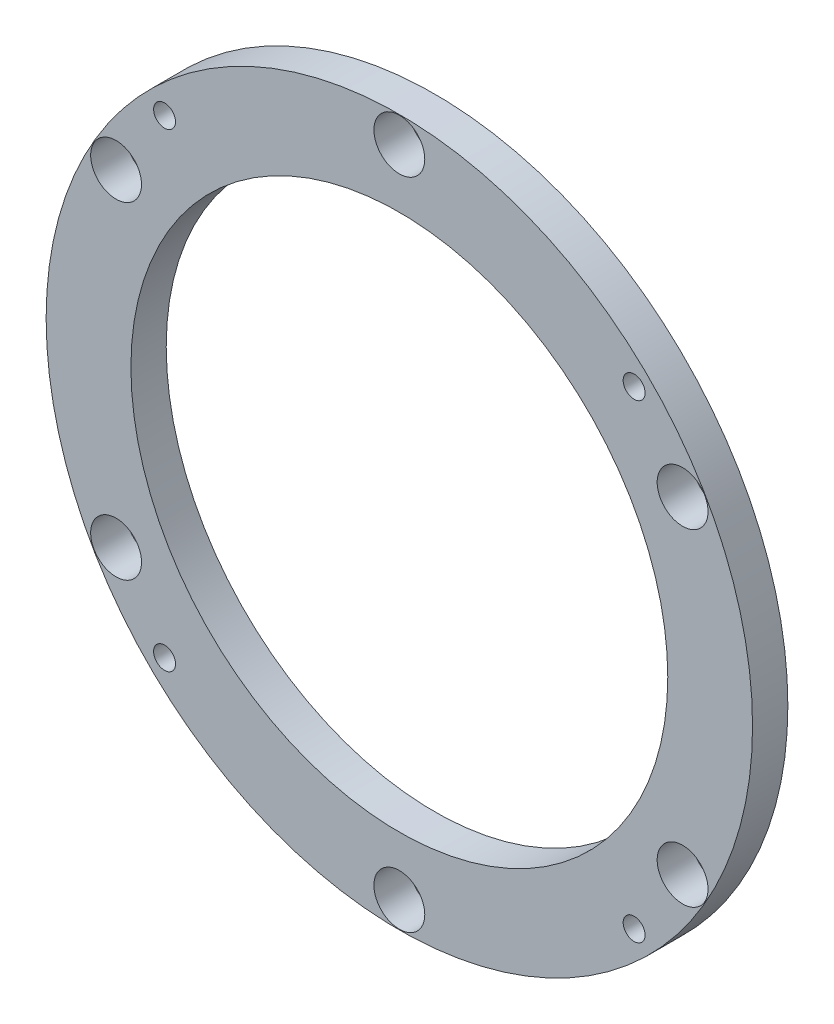
ISO-10303-21;
HEADER;
FILE_DESCRIPTION(('STEP AP214'),'2;1');
FILE_NAME('part.step','',(''),(''),'','','');
FILE_SCHEMA(('AUTOMOTIVE_DESIGN { 1 0 10303 214 1 1 1 1 }'));
ENDSEC;
DATA;
#1=APPLICATION_CONTEXT('core data for automotive mechanical design processes');
#2=APPLICATION_PROTOCOL_DEFINITION('international standard','automotive_design',2000,#1);
#3=PRODUCT_CONTEXT('',#1,'mechanical');
#4=PRODUCT('Part','Part','',(#3));
#5=PRODUCT_RELATED_PRODUCT_CATEGORY('part','',(#4));
#6=PRODUCT_DEFINITION_FORMATION('','',#4);
#7=PRODUCT_DEFINITION_CONTEXT('part definition',#1,'design');
#8=PRODUCT_DEFINITION('design','',#6,#7);
#9=PRODUCT_DEFINITION_SHAPE('','',#8);
#10=(LENGTH_UNIT() NAMED_UNIT(*) SI_UNIT(.MILLI.,.METRE.));
#11=(NAMED_UNIT(*) PLANE_ANGLE_UNIT() SI_UNIT($,.RADIAN.));
#12=(NAMED_UNIT(*) SI_UNIT($,.STERADIAN.) SOLID_ANGLE_UNIT());
#13=UNCERTAINTY_MEASURE_WITH_UNIT(LENGTH_MEASURE(1.E-05),#10,'distance_accuracy_value','');
#14=(GEOMETRIC_REPRESENTATION_CONTEXT(3) GLOBAL_UNCERTAINTY_ASSIGNED_CONTEXT((#13)) GLOBAL_UNIT_ASSIGNED_CONTEXT((#10,
#11,#12)) REPRESENTATION_CONTEXT('',''));
#15=CARTESIAN_POINT('',(0.,0.,0.));
#16=DIRECTION('',(0.,0.,1.));
#17=DIRECTION('',(1.,0.,0.));
#18=AXIS2_PLACEMENT_3D('',#15,#16,#17);
#19=CARTESIAN_POINT('',(0.,0.,5.));
#20=DIRECTION('',(0.,0.,1.));
#21=DIRECTION('',(1.,0.,0.));
#22=AXIS2_PLACEMENT_3D('',#19,#20,#21);
#23=PLANE('',#22);
#24=CARTESIAN_POINT('',(0.,0.,5.));
#25=DIRECTION('',(0.,0.,1.));
#26=DIRECTION('',(1.,0.,0.));
#27=AXIS2_PLACEMENT_3D('',#24,#25,#26);
#28=CIRCLE('',#27,38.);
#29=CARTESIAN_POINT('',(38.,0.,5.));
#30=VERTEX_POINT('',#29);
#31=EDGE_CURVE('E102',#30,#30,#28,.T.);
#32=ORIENTED_EDGE('',*,*,#31,.F.);
#33=EDGE_LOOP('',(#32));
#34=FACE_BOUND('',#33,.T.);
#35=CARTESIAN_POINT('',(33.2340187157698,-33.2340187157657,5.));
#36=DIRECTION('',(0.,0.,1.));
#37=DIRECTION('',(1.,0.,0.));
#38=AXIS2_PLACEMENT_3D('',#35,#36,#37);
#39=CIRCLE('',#38,1.55);
#40=CARTESIAN_POINT('',(34.7840187157698,-33.2340187157657,5.));
#41=VERTEX_POINT('',#40);
#42=EDGE_CURVE('E90',#41,#41,#39,.T.);
#43=ORIENTED_EDGE('',*,*,#42,.F.);
#44=EDGE_LOOP('',(#43));
#45=FACE_BOUND('',#44,.T.);
#46=CARTESIAN_POINT('',(-33.2340187157679,33.2340187157675,5.));
#47=DIRECTION('',(0.,0.,1.));
#48=DIRECTION('',(1.,0.,0.));
#49=AXIS2_PLACEMENT_3D('',#46,#47,#48);
#50=CIRCLE('',#49,1.55);
#51=CARTESIAN_POINT('',(-31.6840187157679,33.2340187157675,5.));
#52=VERTEX_POINT('',#51);
#53=EDGE_CURVE('E78',#52,#52,#50,.T.);
#54=ORIENTED_EDGE('',*,*,#53,.F.);
#55=EDGE_LOOP('',(#54));
#56=FACE_BOUND('',#55,.T.);
#57=CARTESIAN_POINT('',(40.0969761952195,-23.1499999999999,5.));
#58=DIRECTION('',(0.,0.,1.));
#59=DIRECTION('',(1.,0.,0.));
#60=AXIS2_PLACEMENT_3D('',#57,#58,#59);
#61=CIRCLE('',#60,3.6);
#62=CARTESIAN_POINT('',(43.6969761952195,-23.1499999999999,5.));
#63=VERTEX_POINT('',#62);
#64=EDGE_CURVE('E66',#63,#63,#61,.T.);
#65=ORIENTED_EDGE('',*,*,#64,.F.);
#66=EDGE_LOOP('',(#65));
#67=FACE_BOUND('',#66,.T.);
#68=CARTESIAN_POINT('',(-3.05311331771918E-13,46.3,5.));
#69=DIRECTION('',(0.,0.,1.));
#70=DIRECTION('',(1.,0.,0.));
#71=AXIS2_PLACEMENT_3D('',#68,#69,#70);
#72=CIRCLE('',#71,3.6);
#73=CARTESIAN_POINT('',(3.59999999999969,46.3,5.));
#74=VERTEX_POINT('',#73);
#75=EDGE_CURVE('E54',#74,#74,#72,.T.);
#76=ORIENTED_EDGE('',*,*,#75,.F.);
#77=EDGE_LOOP('',(#76));
#78=FACE_BOUND('',#77,.T.);
#79=CARTESIAN_POINT('',(-40.0969761952192,-23.1500000000004,5.));
#80=DIRECTION('',(0.,0.,1.));
#81=DIRECTION('',(1.,0.,0.));
#82=AXIS2_PLACEMENT_3D('',#79,#80,#81);
#83=CIRCLE('',#82,3.6);
#84=CARTESIAN_POINT('',(-36.4969761952192,-23.1500000000004,5.));
#85=VERTEX_POINT('',#84);
#86=EDGE_CURVE('E43',#85,#85,#83,.T.);
#87=ORIENTED_EDGE('',*,*,#86,.F.);
#88=EDGE_LOOP('',(#87));
#89=FACE_BOUND('',#88,.T.);
#90=CARTESIAN_POINT('',(0.,0.,5.));
#91=DIRECTION('',(0.,0.,1.));
#92=DIRECTION('',(1.,0.,0.));
#93=AXIS2_PLACEMENT_3D('',#90,#91,#92);
#94=CIRCLE('',#93,50.);
#95=CARTESIAN_POINT('',(50.,0.,5.));
#96=VERTEX_POINT('',#95);
#97=EDGE_CURVE('E10',#96,#96,#94,.T.);
#98=ORIENTED_EDGE('',*,*,#97,.T.);
#99=EDGE_LOOP('',(#98));
#100=FACE_BOUND('',#99,.T.);
#101=CARTESIAN_POINT('',(-40.0969761952197,23.1499999999996,5.));
#102=DIRECTION('',(0.,0.,1.));
#103=DIRECTION('',(1.,0.,0.));
#104=AXIS2_PLACEMENT_3D('',#101,#102,#103);
#105=CIRCLE('',#104,3.6);
#106=CARTESIAN_POINT('',(-36.4969761952197,23.1499999999996,5.));
#107=VERTEX_POINT('',#106);
#108=EDGE_CURVE('E48',#107,#107,#105,.T.);
#109=ORIENTED_EDGE('',*,*,#108,.F.);
#110=EDGE_LOOP('',(#109));
#111=FACE_BOUND('',#110,.T.);
#112=CARTESIAN_POINT('',(40.0969761952194,23.1500000000001,5.));
#113=DIRECTION('',(0.,0.,1.));
#114=DIRECTION('',(1.,0.,0.));
#115=AXIS2_PLACEMENT_3D('',#112,#113,#114);
#116=CIRCLE('',#115,3.6);
#117=CARTESIAN_POINT('',(43.6969761952194,23.1500000000001,5.));
#118=VERTEX_POINT('',#117);
#119=EDGE_CURVE('E60',#118,#118,#116,.T.);
#120=ORIENTED_EDGE('',*,*,#119,.F.);
#121=EDGE_LOOP('',(#120));
#122=FACE_BOUND('',#121,.T.);
#123=CARTESIAN_POINT('',(0.,-46.3,5.));
#124=DIRECTION('',(0.,0.,1.));
#125=DIRECTION('',(1.,0.,0.));
#126=AXIS2_PLACEMENT_3D('',#123,#124,#125);
#127=CIRCLE('',#126,3.6);
#128=CARTESIAN_POINT('',(3.59999999999998,-46.3,5.));
#129=VERTEX_POINT('',#128);
#130=EDGE_CURVE('E72',#129,#129,#127,.T.);
#131=ORIENTED_EDGE('',*,*,#130,.F.);
#132=EDGE_LOOP('',(#131));
#133=FACE_BOUND('',#132,.T.);
#134=CARTESIAN_POINT('',(33.2340187157676,33.2340187157698,5.));
#135=DIRECTION('',(0.,0.,1.));
#136=DIRECTION('',(1.,0.,0.));
#137=AXIS2_PLACEMENT_3D('',#134,#135,#136);
#138=CIRCLE('',#137,1.55);
#139=CARTESIAN_POINT('',(34.7840187157676,33.2340187157698,5.));
#140=VERTEX_POINT('',#139);
#141=EDGE_CURVE('E84',#140,#140,#138,.T.);
#142=ORIENTED_EDGE('',*,*,#141,.F.);
#143=EDGE_LOOP('',(#142));
#144=FACE_BOUND('',#143,.T.);
#145=CARTESIAN_POINT('',(-33.2340187157657,-33.234018715768,5.));
#146=DIRECTION('',(0.,0.,1.));
#147=DIRECTION('',(1.,0.,0.));
#148=AXIS2_PLACEMENT_3D('',#145,#146,#147);
#149=CIRCLE('',#148,1.55);
#150=CARTESIAN_POINT('',(-31.6840187157657,-33.234018715768,5.));
#151=VERTEX_POINT('',#150);
#152=EDGE_CURVE('E96',#151,#151,#149,.T.);
#153=ORIENTED_EDGE('',*,*,#152,.F.);
#154=EDGE_LOOP('',(#153));
#155=FACE_BOUND('',#154,.T.);
#156=ADVANCED_FACE('F32',(#34,#45,#56,#67,#78,#89,#100,#111,#122,#133,#144,#155),#23,.T.);
#157=CARTESIAN_POINT('',(0.,0.,0.));
#158=DIRECTION('',(0.,0.,1.));
#159=DIRECTION('',(1.,0.,0.));
#160=AXIS2_PLACEMENT_3D('',#157,#158,#159);
#161=PLANE('',#160);
#162=CARTESIAN_POINT('',(0.,0.,0.));
#163=DIRECTION('',(0.,0.,-1.));
#164=DIRECTION('',(-1.,0.,0.));
#165=AXIS2_PLACEMENT_3D('',#162,#163,#164);
#166=CIRCLE('',#165,38.);
#167=CARTESIAN_POINT('',(-38.,0.,0.));
#168=VERTEX_POINT('',#167);
#169=EDGE_CURVE('E107',#168,#168,#166,.T.);
#170=ORIENTED_EDGE('',*,*,#169,.F.);
#171=EDGE_LOOP('',(#170));
#172=FACE_BOUND('',#171,.T.);
#173=CARTESIAN_POINT('',(0.,0.,0.));
#174=DIRECTION('',(0.,0.,1.));
#175=DIRECTION('',(1.,0.,0.));
#176=AXIS2_PLACEMENT_3D('',#173,#174,#175);
#177=CIRCLE('',#176,50.);
#178=CARTESIAN_POINT('',(50.,0.,0.));
#179=VERTEX_POINT('',#178);
#180=EDGE_CURVE('E36',#179,#179,#177,.T.);
#181=ORIENTED_EDGE('',*,*,#180,.F.);
#182=EDGE_LOOP('',(#181));
#183=FACE_BOUND('',#182,.T.);
#184=CARTESIAN_POINT('',(-40.0969761952192,-23.1500000000004,0.));
#185=DIRECTION('',(0.,0.,1.));
#186=DIRECTION('',(1.,0.,0.));
#187=AXIS2_PLACEMENT_3D('',#184,#185,#186);
#188=CIRCLE('',#187,3.6);
#189=CARTESIAN_POINT('',(-36.4969761952192,-23.1500000000004,0.));
#190=VERTEX_POINT('',#189);
#191=EDGE_CURVE('E45',#190,#190,#188,.T.);
#192=ORIENTED_EDGE('',*,*,#191,.T.);
#193=EDGE_LOOP('',(#192));
#194=FACE_BOUND('',#193,.T.);
#195=CARTESIAN_POINT('',(-40.0969761952197,23.1499999999996,0.));
#196=DIRECTION('',(0.,0.,1.));
#197=DIRECTION('',(1.,0.,0.));
#198=AXIS2_PLACEMENT_3D('',#195,#196,#197);
#199=CIRCLE('',#198,3.6);
#200=CARTESIAN_POINT('',(-36.4969761952197,23.1499999999996,0.));
#201=VERTEX_POINT('',#200);
#202=EDGE_CURVE('E51',#201,#201,#199,.T.);
#203=ORIENTED_EDGE('',*,*,#202,.T.);
#204=EDGE_LOOP('',(#203));
#205=FACE_BOUND('',#204,.T.);
#206=CARTESIAN_POINT('',(-3.05311331771918E-13,46.3,0.));
#207=DIRECTION('',(0.,0.,1.));
#208=DIRECTION('',(1.,0.,0.));
#209=AXIS2_PLACEMENT_3D('',#206,#207,#208);
#210=CIRCLE('',#209,3.6);
#211=CARTESIAN_POINT('',(3.59999999999969,46.3,0.));
#212=VERTEX_POINT('',#211);
#213=EDGE_CURVE('E57',#212,#212,#210,.T.);
#214=ORIENTED_EDGE('',*,*,#213,.T.);
#215=EDGE_LOOP('',(#214));
#216=FACE_BOUND('',#215,.T.);
#217=CARTESIAN_POINT('',(40.0969761952194,23.1500000000001,0.));
#218=DIRECTION('',(0.,0.,1.));
#219=DIRECTION('',(1.,0.,0.));
#220=AXIS2_PLACEMENT_3D('',#217,#218,#219);
#221=CIRCLE('',#220,3.6);
#222=CARTESIAN_POINT('',(43.6969761952194,23.1500000000001,0.));
#223=VERTEX_POINT('',#222);
#224=EDGE_CURVE('E63',#223,#223,#221,.T.);
#225=ORIENTED_EDGE('',*,*,#224,.T.);
#226=EDGE_LOOP('',(#225));
#227=FACE_BOUND('',#226,.T.);
#228=CARTESIAN_POINT('',(40.0969761952195,-23.1499999999999,0.));
#229=DIRECTION('',(0.,0.,1.));
#230=DIRECTION('',(1.,0.,0.));
#231=AXIS2_PLACEMENT_3D('',#228,#229,#230);
#232=CIRCLE('',#231,3.6);
#233=CARTESIAN_POINT('',(43.6969761952195,-23.1499999999999,0.));
#234=VERTEX_POINT('',#233);
#235=EDGE_CURVE('E69',#234,#234,#232,.T.);
#236=ORIENTED_EDGE('',*,*,#235,.T.);
#237=EDGE_LOOP('',(#236));
#238=FACE_BOUND('',#237,.T.);
#239=CARTESIAN_POINT('',(0.,-46.3,0.));
#240=DIRECTION('',(0.,0.,1.));
#241=DIRECTION('',(1.,0.,0.));
#242=AXIS2_PLACEMENT_3D('',#239,#240,#241);
#243=CIRCLE('',#242,3.6);
#244=CARTESIAN_POINT('',(3.59999999999998,-46.3,0.));
#245=VERTEX_POINT('',#244);
#246=EDGE_CURVE('E75',#245,#245,#243,.T.);
#247=ORIENTED_EDGE('',*,*,#246,.T.);
#248=EDGE_LOOP('',(#247));
#249=FACE_BOUND('',#248,.T.);
#250=CARTESIAN_POINT('',(-33.2340187157679,33.2340187157675,0.));
#251=DIRECTION('',(0.,0.,1.));
#252=DIRECTION('',(1.,0.,0.));
#253=AXIS2_PLACEMENT_3D('',#250,#251,#252);
#254=CIRCLE('',#253,1.55);
#255=CARTESIAN_POINT('',(-31.6840187157679,33.2340187157675,0.));
#256=VERTEX_POINT('',#255);
#257=EDGE_CURVE('E81',#256,#256,#254,.T.);
#258=ORIENTED_EDGE('',*,*,#257,.T.);
#259=EDGE_LOOP('',(#258));
#260=FACE_BOUND('',#259,.T.);
#261=CARTESIAN_POINT('',(33.2340187157676,33.2340187157698,0.));
#262=DIRECTION('',(0.,0.,1.));
#263=DIRECTION('',(1.,0.,0.));
#264=AXIS2_PLACEMENT_3D('',#261,#262,#263);
#265=CIRCLE('',#264,1.55);
#266=CARTESIAN_POINT('',(34.7840187157676,33.2340187157698,0.));
#267=VERTEX_POINT('',#266);
#268=EDGE_CURVE('E87',#267,#267,#265,.T.);
#269=ORIENTED_EDGE('',*,*,#268,.T.);
#270=EDGE_LOOP('',(#269));
#271=FACE_BOUND('',#270,.T.);
#272=CARTESIAN_POINT('',(33.2340187157698,-33.2340187157657,0.));
#273=DIRECTION('',(0.,0.,1.));
#274=DIRECTION('',(1.,0.,0.));
#275=AXIS2_PLACEMENT_3D('',#272,#273,#274);
#276=CIRCLE('',#275,1.55);
#277=CARTESIAN_POINT('',(34.7840187157698,-33.2340187157657,0.));
#278=VERTEX_POINT('',#277);
#279=EDGE_CURVE('E93',#278,#278,#276,.T.);
#280=ORIENTED_EDGE('',*,*,#279,.T.);
#281=EDGE_LOOP('',(#280));
#282=FACE_BOUND('',#281,.T.);
#283=CARTESIAN_POINT('',(-33.2340187157657,-33.234018715768,0.));
#284=DIRECTION('',(0.,0.,1.));
#285=DIRECTION('',(1.,0.,0.));
#286=AXIS2_PLACEMENT_3D('',#283,#284,#285);
#287=CIRCLE('',#286,1.55);
#288=CARTESIAN_POINT('',(-31.6840187157657,-33.234018715768,0.));
#289=VERTEX_POINT('',#288);
#290=EDGE_CURVE('E99',#289,#289,#287,.T.);
#291=ORIENTED_EDGE('',*,*,#290,.T.);
#292=EDGE_LOOP('',(#291));
#293=FACE_BOUND('',#292,.T.);
#294=ADVANCED_FACE('F113',(#172,#183,#194,#205,#216,#227,#238,#249,#260,#271,#282,#293),#161,.F.);
#295=CARTESIAN_POINT('',(0.,0.,5.));
#296=DIRECTION('',(0.,0.,-1.));
#297=DIRECTION('',(-1.,0.,0.));
#298=AXIS2_PLACEMENT_3D('',#295,#296,#297);
#299=CYLINDRICAL_SURFACE('',#298,50.);
#300=ORIENTED_EDGE('',*,*,#97,.F.);
#301=EDGE_LOOP('',(#300));
#302=FACE_BOUND('',#301,.T.);
#303=ORIENTED_EDGE('',*,*,#180,.T.);
#304=EDGE_LOOP('',(#303));
#305=FACE_BOUND('',#304,.T.);
#306=ADVANCED_FACE('F34',(#302,#305),#299,.T.);
#307=CARTESIAN_POINT('',(-40.0969761952192,-23.1500000000004,5.));
#308=DIRECTION('',(0.,0.,-1.));
#309=DIRECTION('',(-1.,0.,0.));
#310=AXIS2_PLACEMENT_3D('',#307,#308,#309);
#311=CYLINDRICAL_SURFACE('',#310,3.6);
#312=ORIENTED_EDGE('',*,*,#86,.T.);
#313=EDGE_LOOP('',(#312));
#314=FACE_BOUND('',#313,.T.);
#315=ORIENTED_EDGE('',*,*,#191,.F.);
#316=EDGE_LOOP('',(#315));
#317=FACE_BOUND('',#316,.T.);
#318=ADVANCED_FACE('F160',(#314,#317),#311,.F.);
#319=CARTESIAN_POINT('',(-40.0969761952197,23.1499999999996,5.));
#320=DIRECTION('',(0.,0.,-1.));
#321=DIRECTION('',(-1.,0.,0.));
#322=AXIS2_PLACEMENT_3D('',#319,#320,#321);
#323=CYLINDRICAL_SURFACE('',#322,3.6);
#324=ORIENTED_EDGE('',*,*,#108,.T.);
#325=EDGE_LOOP('',(#324));
#326=FACE_BOUND('',#325,.T.);
#327=ORIENTED_EDGE('',*,*,#202,.F.);
#328=EDGE_LOOP('',(#327));
#329=FACE_BOUND('',#328,.T.);
#330=ADVANCED_FACE('F163',(#326,#329),#323,.F.);
#331=CARTESIAN_POINT('',(-3.05311331771918E-13,46.3,5.));
#332=DIRECTION('',(0.,0.,-1.));
#333=DIRECTION('',(-1.,0.,0.));
#334=AXIS2_PLACEMENT_3D('',#331,#332,#333);
#335=CYLINDRICAL_SURFACE('',#334,3.6);
#336=ORIENTED_EDGE('',*,*,#75,.T.);
#337=EDGE_LOOP('',(#336));
#338=FACE_BOUND('',#337,.T.);
#339=ORIENTED_EDGE('',*,*,#213,.F.);
#340=EDGE_LOOP('',(#339));
#341=FACE_BOUND('',#340,.T.);
#342=ADVANCED_FACE('F167',(#338,#341),#335,.F.);
#343=CARTESIAN_POINT('',(40.0969761952194,23.1500000000001,5.));
#344=DIRECTION('',(0.,0.,-1.));
#345=DIRECTION('',(-1.,0.,0.));
#346=AXIS2_PLACEMENT_3D('',#343,#344,#345);
#347=CYLINDRICAL_SURFACE('',#346,3.6);
#348=ORIENTED_EDGE('',*,*,#119,.T.);
#349=EDGE_LOOP('',(#348));
#350=FACE_BOUND('',#349,.T.);
#351=ORIENTED_EDGE('',*,*,#224,.F.);
#352=EDGE_LOOP('',(#351));
#353=FACE_BOUND('',#352,.T.);
#354=ADVANCED_FACE('F171',(#350,#353),#347,.F.);
#355=CARTESIAN_POINT('',(40.0969761952195,-23.1499999999999,5.));
#356=DIRECTION('',(0.,0.,-1.));
#357=DIRECTION('',(-1.,0.,0.));
#358=AXIS2_PLACEMENT_3D('',#355,#356,#357);
#359=CYLINDRICAL_SURFACE('',#358,3.6);
#360=ORIENTED_EDGE('',*,*,#64,.T.);
#361=EDGE_LOOP('',(#360));
#362=FACE_BOUND('',#361,.T.);
#363=ORIENTED_EDGE('',*,*,#235,.F.);
#364=EDGE_LOOP('',(#363));
#365=FACE_BOUND('',#364,.T.);
#366=ADVANCED_FACE('F175',(#362,#365),#359,.F.);
#367=CARTESIAN_POINT('',(0.,-46.3,5.));
#368=DIRECTION('',(0.,0.,-1.));
#369=DIRECTION('',(-1.,0.,0.));
#370=AXIS2_PLACEMENT_3D('',#367,#368,#369);
#371=CYLINDRICAL_SURFACE('',#370,3.6);
#372=ORIENTED_EDGE('',*,*,#130,.T.);
#373=EDGE_LOOP('',(#372));
#374=FACE_BOUND('',#373,.T.);
#375=ORIENTED_EDGE('',*,*,#246,.F.);
#376=EDGE_LOOP('',(#375));
#377=FACE_BOUND('',#376,.T.);
#378=ADVANCED_FACE('F179',(#374,#377),#371,.F.);
#379=CARTESIAN_POINT('',(-33.2340187157679,33.2340187157675,5.));
#380=DIRECTION('',(0.,0.,-1.));
#381=DIRECTION('',(-1.,0.,0.));
#382=AXIS2_PLACEMENT_3D('',#379,#380,#381);
#383=CYLINDRICAL_SURFACE('',#382,1.55);
#384=ORIENTED_EDGE('',*,*,#53,.T.);
#385=EDGE_LOOP('',(#384));
#386=FACE_BOUND('',#385,.T.);
#387=ORIENTED_EDGE('',*,*,#257,.F.);
#388=EDGE_LOOP('',(#387));
#389=FACE_BOUND('',#388,.T.);
#390=ADVANCED_FACE('F183',(#386,#389),#383,.F.);
#391=CARTESIAN_POINT('',(33.2340187157676,33.2340187157698,5.));
#392=DIRECTION('',(0.,0.,-1.));
#393=DIRECTION('',(-1.,0.,0.));
#394=AXIS2_PLACEMENT_3D('',#391,#392,#393);
#395=CYLINDRICAL_SURFACE('',#394,1.55);
#396=ORIENTED_EDGE('',*,*,#141,.T.);
#397=EDGE_LOOP('',(#396));
#398=FACE_BOUND('',#397,.T.);
#399=ORIENTED_EDGE('',*,*,#268,.F.);
#400=EDGE_LOOP('',(#399));
#401=FACE_BOUND('',#400,.T.);
#402=ADVANCED_FACE('F149',(#398,#401),#395,.F.);
#403=CARTESIAN_POINT('',(33.2340187157698,-33.2340187157657,5.));
#404=DIRECTION('',(0.,0.,-1.));
#405=DIRECTION('',(-1.,0.,0.));
#406=AXIS2_PLACEMENT_3D('',#403,#404,#405);
#407=CYLINDRICAL_SURFACE('',#406,1.55);
#408=ORIENTED_EDGE('',*,*,#42,.T.);
#409=EDGE_LOOP('',(#408));
#410=FACE_BOUND('',#409,.T.);
#411=ORIENTED_EDGE('',*,*,#279,.F.);
#412=EDGE_LOOP('',(#411));
#413=FACE_BOUND('',#412,.T.);
#414=ADVANCED_FACE('F140',(#410,#413),#407,.F.);
#415=CARTESIAN_POINT('',(-33.2340187157657,-33.234018715768,5.));
#416=DIRECTION('',(0.,0.,-1.));
#417=DIRECTION('',(-1.,0.,0.));
#418=AXIS2_PLACEMENT_3D('',#415,#416,#417);
#419=CYLINDRICAL_SURFACE('',#418,1.55);
#420=ORIENTED_EDGE('',*,*,#152,.T.);
#421=EDGE_LOOP('',(#420));
#422=FACE_BOUND('',#421,.T.);
#423=ORIENTED_EDGE('',*,*,#290,.F.);
#424=EDGE_LOOP('',(#423));
#425=FACE_BOUND('',#424,.T.);
#426=ADVANCED_FACE('F138',(#422,#425),#419,.F.);
#427=CARTESIAN_POINT('',(0.,0.,10.));
#428=DIRECTION('',(0.,0.,-1.));
#429=DIRECTION('',(-1.,0.,0.));
#430=AXIS2_PLACEMENT_3D('',#427,#428,#429);
#431=CYLINDRICAL_SURFACE('',#430,38.);
#432=ORIENTED_EDGE('',*,*,#31,.T.);
#433=EDGE_LOOP('',(#432));
#434=FACE_BOUND('',#433,.T.);
#435=ORIENTED_EDGE('',*,*,#169,.T.);
#436=EDGE_LOOP('',(#435));
#437=FACE_BOUND('',#436,.T.);
#438=ADVANCED_FACE('F111',(#434,#437),#431,.F.);
#439=CLOSED_SHELL('',(#156,#294,#306,#318,#330,#342,#354,#366,#378,#390,#402,#414,#426,#438));
#440=MANIFOLD_SOLID_BREP('B2',#439);
#441=ADVANCED_BREP_SHAPE_REPRESENTATION('',(#18,#440),#14);
#442=SHAPE_DEFINITION_REPRESENTATION(#9,#441);
ENDSEC;
END-ISO-10303-21;
